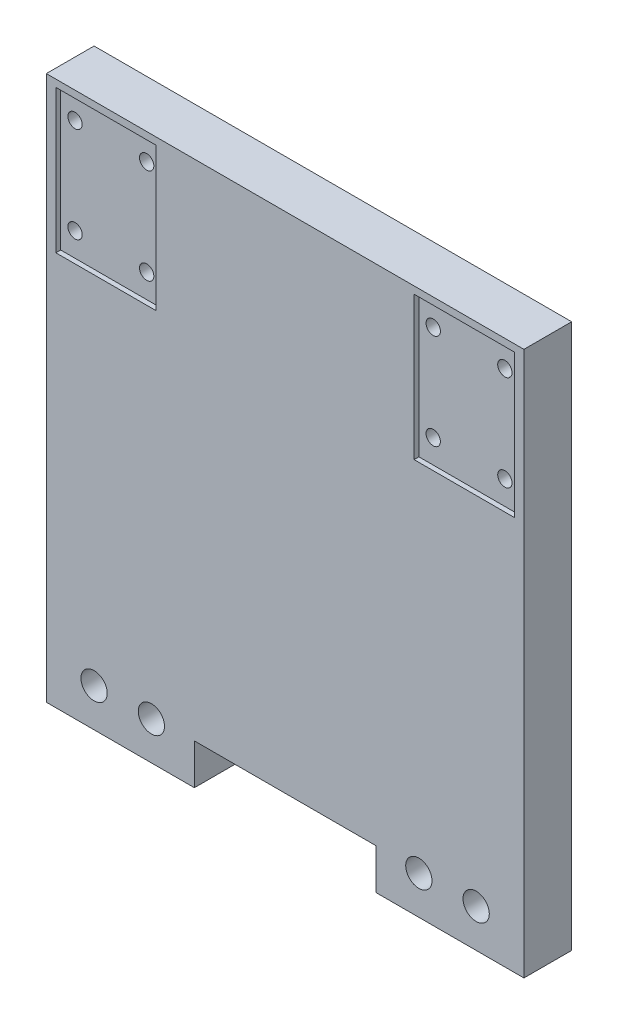
ISO-10303-21;
HEADER;
FILE_DESCRIPTION(('STEP AP214'),'2;1');
FILE_NAME('part.step','',(''),(''),'','','');
FILE_SCHEMA(('AUTOMOTIVE_DESIGN { 1 0 10303 214 1 1 1 1 }'));
ENDSEC;
DATA;
#1=APPLICATION_CONTEXT('core data for automotive mechanical design processes');
#2=APPLICATION_PROTOCOL_DEFINITION('international standard','automotive_design',2000,#1);
#3=PRODUCT_CONTEXT('',#1,'mechanical');
#4=PRODUCT('Part','Part','',(#3));
#5=PRODUCT_RELATED_PRODUCT_CATEGORY('part','',(#4));
#6=PRODUCT_DEFINITION_FORMATION('','',#4);
#7=PRODUCT_DEFINITION_CONTEXT('part definition',#1,'design');
#8=PRODUCT_DEFINITION('design','',#6,#7);
#9=PRODUCT_DEFINITION_SHAPE('','',#8);
#10=(LENGTH_UNIT() NAMED_UNIT(*) SI_UNIT(.MILLI.,.METRE.));
#11=(NAMED_UNIT(*) PLANE_ANGLE_UNIT() SI_UNIT($,.RADIAN.));
#12=(NAMED_UNIT(*) SI_UNIT($,.STERADIAN.) SOLID_ANGLE_UNIT());
#13=UNCERTAINTY_MEASURE_WITH_UNIT(LENGTH_MEASURE(1.E-05),#10,'distance_accuracy_value','');
#14=(GEOMETRIC_REPRESENTATION_CONTEXT(3) GLOBAL_UNCERTAINTY_ASSIGNED_CONTEXT((#13)) GLOBAL_UNIT_ASSIGNED_CONTEXT((#10,
#11,#12)) REPRESENTATION_CONTEXT('',''));
#15=CARTESIAN_POINT('',(0.,0.,0.));
#16=DIRECTION('',(0.,0.,1.));
#17=DIRECTION('',(1.,0.,0.));
#18=AXIS2_PLACEMENT_3D('',#15,#16,#17);
#19=CARTESIAN_POINT('',(2.,82.5,8.989915219719));
#20=DIRECTION('',(1.,0.,0.));
#21=DIRECTION('',(0.,0.,-1.));
#22=AXIS2_PLACEMENT_3D('',#19,#20,#21);
#23=PLANE('',#22);
#24=DIRECTION('',(0.,0.,1.));
#25=VECTOR('',#24,1.);
#26=CARTESIAN_POINT('',(2.,112.5,8.989915219719));
#27=LINE('',#26,#25);
#28=CARTESIAN_POINT('',(2.,112.5,8.989915219719));
#29=VERTEX_POINT('',#28);
#30=CARTESIAN_POINT('',(2.,112.5,10.0019));
#31=VERTEX_POINT('',#30);
#32=EDGE_CURVE('E147',#29,#31,#27,.T.);
#33=ORIENTED_EDGE('',*,*,#32,.T.);
#34=DIRECTION('',(0.,1.,0.));
#35=VECTOR('',#34,1.);
#36=CARTESIAN_POINT('',(2.,0.,10.0019));
#37=LINE('',#36,#35);
#38=CARTESIAN_POINT('',(2.,82.5,10.0019));
#39=VERTEX_POINT('',#38);
#40=EDGE_CURVE('E134',#39,#31,#37,.T.);
#41=ORIENTED_EDGE('',*,*,#40,.F.);
#42=DIRECTION('',(0.,0.,1.));
#43=VECTOR('',#42,1.);
#44=CARTESIAN_POINT('',(2.,82.5,8.989915219719));
#45=LINE('',#44,#43);
#46=CARTESIAN_POINT('',(2.,82.5,8.989915219719));
#47=VERTEX_POINT('',#46);
#48=EDGE_CURVE('E128',#47,#39,#45,.T.);
#49=ORIENTED_EDGE('',*,*,#48,.F.);
#50=DIRECTION('',(0.,1.,0.));
#51=VECTOR('',#50,1.);
#52=CARTESIAN_POINT('',(2.,82.5,8.989915219719));
#53=LINE('',#52,#51);
#54=EDGE_CURVE('E148',#29,#47,#53,.F.);
#55=ORIENTED_EDGE('',*,*,#54,.F.);
#56=EDGE_LOOP('',(#33,#41,#49,#55));
#57=FACE_BOUND('',#56,.T.);
#58=ADVANCED_FACE('F16',(#57),#23,.T.);
#59=CARTESIAN_POINT('',(2.,82.5,8.989915219719));
#60=DIRECTION('',(0.,1.,0.));
#61=DIRECTION('',(0.,0.,1.));
#62=AXIS2_PLACEMENT_3D('',#59,#60,#61);
#63=PLANE('',#62);
#64=DIRECTION('',(1.,0.,0.));
#65=VECTOR('',#64,1.);
#66=CARTESIAN_POINT('',(0.,82.5,10.0019));
#67=LINE('',#66,#65);
#68=CARTESIAN_POINT('',(23.,82.5,10.0019));
#69=VERTEX_POINT('',#68);
#70=EDGE_CURVE('E142',#69,#39,#67,.F.);
#71=ORIENTED_EDGE('',*,*,#70,.F.);
#72=DIRECTION('',(0.,0.,-1.));
#73=VECTOR('',#72,1.);
#74=CARTESIAN_POINT('',(23.,82.5,8.989915219719));
#75=LINE('',#74,#73);
#76=CARTESIAN_POINT('',(23.,82.5,8.989915219719));
#77=VERTEX_POINT('',#76);
#78=EDGE_CURVE('E153',#69,#77,#75,.T.);
#79=ORIENTED_EDGE('',*,*,#78,.T.);
#80=DIRECTION('',(1.,0.,0.));
#81=VECTOR('',#80,1.);
#82=CARTESIAN_POINT('',(2.,82.5,8.989915219719));
#83=LINE('',#82,#81);
#84=EDGE_CURVE('E301',#47,#77,#83,.T.);
#85=ORIENTED_EDGE('',*,*,#84,.F.);
#86=ORIENTED_EDGE('',*,*,#48,.T.);
#87=EDGE_LOOP('',(#71,#79,#85,#86));
#88=FACE_BOUND('',#87,.T.);
#89=ADVANCED_FACE('F485',(#88),#63,.T.);
#90=CARTESIAN_POINT('',(23.,82.5,8.989915219719));
#91=DIRECTION('',(1.,0.,0.));
#92=DIRECTION('',(0.,0.,-1.));
#93=AXIS2_PLACEMENT_3D('',#90,#91,#92);
#94=PLANE('',#93);
#95=DIRECTION('',(0.,0.,1.));
#96=VECTOR('',#95,1.);
#97=CARTESIAN_POINT('',(23.,112.5,8.989915219719));
#98=LINE('',#97,#96);
#99=CARTESIAN_POINT('',(23.,112.5,10.0019));
#100=VERTEX_POINT('',#99);
#101=CARTESIAN_POINT('',(23.,112.5,8.989915219719));
#102=VERTEX_POINT('',#101);
#103=EDGE_CURVE('E152',#100,#102,#98,.F.);
#104=ORIENTED_EDGE('',*,*,#103,.T.);
#105=DIRECTION('',(0.,1.,0.));
#106=VECTOR('',#105,1.);
#107=CARTESIAN_POINT('',(23.,82.5,8.989915219719));
#108=LINE('',#107,#106);
#109=EDGE_CURVE('E299',#77,#102,#108,.T.);
#110=ORIENTED_EDGE('',*,*,#109,.F.);
#111=ORIENTED_EDGE('',*,*,#78,.F.);
#112=DIRECTION('',(0.,1.,0.));
#113=VECTOR('',#112,1.);
#114=CARTESIAN_POINT('',(23.,0.,10.0019));
#115=LINE('',#114,#113);
#116=EDGE_CURVE('E157',#100,#69,#115,.F.);
#117=ORIENTED_EDGE('',*,*,#116,.F.);
#118=EDGE_LOOP('',(#104,#110,#111,#117));
#119=FACE_BOUND('',#118,.T.);
#120=ADVANCED_FACE('F483',(#119),#94,.F.);
#121=CARTESIAN_POINT('',(2.,112.5,8.989915219719));
#122=DIRECTION('',(0.,1.,0.));
#123=DIRECTION('',(0.,0.,1.));
#124=AXIS2_PLACEMENT_3D('',#121,#122,#123);
#125=PLANE('',#124);
#126=DIRECTION('',(1.,0.,0.));
#127=VECTOR('',#126,1.);
#128=CARTESIAN_POINT('',(0.,112.5,10.0019));
#129=LINE('',#128,#127);
#130=EDGE_CURVE('E140',#31,#100,#129,.T.);
#131=ORIENTED_EDGE('',*,*,#130,.F.);
#132=ORIENTED_EDGE('',*,*,#32,.F.);
#133=DIRECTION('',(1.,0.,0.));
#134=VECTOR('',#133,1.);
#135=CARTESIAN_POINT('',(2.,112.5,8.989915219719));
#136=LINE('',#135,#134);
#137=EDGE_CURVE('E297',#102,#29,#136,.F.);
#138=ORIENTED_EDGE('',*,*,#137,.F.);
#139=ORIENTED_EDGE('',*,*,#103,.F.);
#140=EDGE_LOOP('',(#131,#132,#138,#139));
#141=FACE_BOUND('',#140,.T.);
#142=ADVANCED_FACE('F155',(#141),#125,.F.);
#143=CARTESIAN_POINT('',(77.,82.5,8.989915219719));
#144=DIRECTION('',(1.,0.,0.));
#145=DIRECTION('',(0.,0.,-1.));
#146=AXIS2_PLACEMENT_3D('',#143,#144,#145);
#147=PLANE('',#146);
#148=DIRECTION('',(0.,0.,1.));
#149=VECTOR('',#148,1.);
#150=CARTESIAN_POINT('',(77.,112.5,8.989915219719));
#151=LINE('',#150,#149);
#152=CARTESIAN_POINT('',(77.,112.5,8.989915219719));
#153=VERTEX_POINT('',#152);
#154=CARTESIAN_POINT('',(77.,112.5,10.0019));
#155=VERTEX_POINT('',#154);
#156=EDGE_CURVE('E164',#153,#155,#151,.T.);
#157=ORIENTED_EDGE('',*,*,#156,.T.);
#158=DIRECTION('',(0.,1.,0.));
#159=VECTOR('',#158,1.);
#160=CARTESIAN_POINT('',(77.,0.,10.0019));
#161=LINE('',#160,#159);
#162=CARTESIAN_POINT('',(77.,82.5,10.0019));
#163=VERTEX_POINT('',#162);
#164=EDGE_CURVE('E313',#163,#155,#161,.T.);
#165=ORIENTED_EDGE('',*,*,#164,.F.);
#166=DIRECTION('',(0.,0.,1.));
#167=VECTOR('',#166,1.);
#168=CARTESIAN_POINT('',(77.,82.5,8.989915219719));
#169=LINE('',#168,#167);
#170=CARTESIAN_POINT('',(77.,82.5,8.989915219719));
#171=VERTEX_POINT('',#170);
#172=EDGE_CURVE('E170',#171,#163,#169,.T.);
#173=ORIENTED_EDGE('',*,*,#172,.F.);
#174=DIRECTION('',(0.,1.,0.));
#175=VECTOR('',#174,1.);
#176=CARTESIAN_POINT('',(77.,82.5,8.989915219719));
#177=LINE('',#176,#175);
#178=EDGE_CURVE('E295',#153,#171,#177,.F.);
#179=ORIENTED_EDGE('',*,*,#178,.F.);
#180=EDGE_LOOP('',(#157,#165,#173,#179));
#181=FACE_BOUND('',#180,.T.);
#182=ADVANCED_FACE('F322',(#181),#147,.T.);
#183=CARTESIAN_POINT('',(77.,82.5,8.989915219719));
#184=DIRECTION('',(0.,1.,0.));
#185=DIRECTION('',(0.,0.,1.));
#186=AXIS2_PLACEMENT_3D('',#183,#184,#185);
#187=PLANE('',#186);
#188=DIRECTION('',(1.,0.,0.));
#189=VECTOR('',#188,1.);
#190=CARTESIAN_POINT('',(0.,82.5,10.0019));
#191=LINE('',#190,#189);
#192=CARTESIAN_POINT('',(98.,82.5,10.0019));
#193=VERTEX_POINT('',#192);
#194=EDGE_CURVE('E304',#193,#163,#191,.F.);
#195=ORIENTED_EDGE('',*,*,#194,.F.);
#196=DIRECTION('',(0.,0.,-1.));
#197=VECTOR('',#196,1.);
#198=CARTESIAN_POINT('',(98.,82.5,8.989915219719));
#199=LINE('',#198,#197);
#200=CARTESIAN_POINT('',(98.,82.5,8.989915219719));
#201=VERTEX_POINT('',#200);
#202=EDGE_CURVE('E167',#193,#201,#199,.T.);
#203=ORIENTED_EDGE('',*,*,#202,.T.);
#204=DIRECTION('',(1.,0.,0.));
#205=VECTOR('',#204,1.);
#206=CARTESIAN_POINT('',(77.,82.5,8.989915219719));
#207=LINE('',#206,#205);
#208=EDGE_CURVE('E293',#171,#201,#207,.T.);
#209=ORIENTED_EDGE('',*,*,#208,.F.);
#210=ORIENTED_EDGE('',*,*,#172,.T.);
#211=EDGE_LOOP('',(#195,#203,#209,#210));
#212=FACE_BOUND('',#211,.T.);
#213=ADVANCED_FACE('F330',(#212),#187,.T.);
#214=CARTESIAN_POINT('',(98.,82.5,8.989915219719));
#215=DIRECTION('',(1.,0.,0.));
#216=DIRECTION('',(0.,0.,-1.));
#217=AXIS2_PLACEMENT_3D('',#214,#215,#216);
#218=PLANE('',#217);
#219=DIRECTION('',(0.,0.,1.));
#220=VECTOR('',#219,1.);
#221=CARTESIAN_POINT('',(98.,112.5,8.989915219719));
#222=LINE('',#221,#220);
#223=CARTESIAN_POINT('',(98.,112.5,10.0019));
#224=VERTEX_POINT('',#223);
#225=CARTESIAN_POINT('',(98.,112.5,8.989915219719));
#226=VERTEX_POINT('',#225);
#227=EDGE_CURVE('E144',#224,#226,#222,.F.);
#228=ORIENTED_EDGE('',*,*,#227,.T.);
#229=DIRECTION('',(0.,1.,0.));
#230=VECTOR('',#229,1.);
#231=CARTESIAN_POINT('',(98.,82.5,8.989915219719));
#232=LINE('',#231,#230);
#233=EDGE_CURVE('E291',#201,#226,#232,.T.);
#234=ORIENTED_EDGE('',*,*,#233,.F.);
#235=ORIENTED_EDGE('',*,*,#202,.F.);
#236=DIRECTION('',(0.,1.,0.));
#237=VECTOR('',#236,1.);
#238=CARTESIAN_POINT('',(98.,0.,10.0019));
#239=LINE('',#238,#237);
#240=EDGE_CURVE('E307',#224,#193,#239,.F.);
#241=ORIENTED_EDGE('',*,*,#240,.F.);
#242=EDGE_LOOP('',(#228,#234,#235,#241));
#243=FACE_BOUND('',#242,.T.);
#244=ADVANCED_FACE('F328',(#243),#218,.F.);
#245=CARTESIAN_POINT('',(77.,112.5,8.989915219719));
#246=DIRECTION('',(0.,1.,0.));
#247=DIRECTION('',(0.,0.,1.));
#248=AXIS2_PLACEMENT_3D('',#245,#246,#247);
#249=PLANE('',#248);
#250=DIRECTION('',(1.,0.,0.));
#251=VECTOR('',#250,1.);
#252=CARTESIAN_POINT('',(0.,112.5,10.0019));
#253=LINE('',#252,#251);
#254=EDGE_CURVE('E310',#155,#224,#253,.T.);
#255=ORIENTED_EDGE('',*,*,#254,.F.);
#256=ORIENTED_EDGE('',*,*,#156,.F.);
#257=DIRECTION('',(1.,0.,0.));
#258=VECTOR('',#257,1.);
#259=CARTESIAN_POINT('',(77.,112.5,8.989915219719));
#260=LINE('',#259,#258);
#261=EDGE_CURVE('E288',#226,#153,#260,.F.);
#262=ORIENTED_EDGE('',*,*,#261,.F.);
#263=ORIENTED_EDGE('',*,*,#227,.F.);
#264=EDGE_LOOP('',(#255,#256,#262,#263));
#265=FACE_BOUND('',#264,.T.);
#266=ADVANCED_FACE('F325',(#265),#249,.F.);
#267=CARTESIAN_POINT('',(0.,0.,10.0019));
#268=DIRECTION('',(0.,0.,1.));
#269=DIRECTION('',(1.,0.,0.));
#270=AXIS2_PLACEMENT_3D('',#267,#268,#269);
#271=PLANE('',#270);
#272=ORIENTED_EDGE('',*,*,#240,.T.);
#273=ORIENTED_EDGE('',*,*,#194,.T.);
#274=ORIENTED_EDGE('',*,*,#164,.T.);
#275=ORIENTED_EDGE('',*,*,#254,.T.);
#276=EDGE_LOOP('',(#272,#273,#274,#275));
#277=FACE_BOUND('',#276,.T.);
#278=ORIENTED_EDGE('',*,*,#116,.T.);
#279=ORIENTED_EDGE('',*,*,#70,.T.);
#280=ORIENTED_EDGE('',*,*,#40,.T.);
#281=ORIENTED_EDGE('',*,*,#130,.T.);
#282=EDGE_LOOP('',(#278,#279,#280,#281));
#283=FACE_BOUND('',#282,.T.);
#284=CARTESIAN_POINT('',(90.,8.,10.0019));
#285=DIRECTION('',(0.,0.,1.));
#286=DIRECTION('',(1.,0.,0.));
#287=AXIS2_PLACEMENT_3D('',#284,#285,#286);
#288=CIRCLE('',#287,2.75);
#289=CARTESIAN_POINT('',(92.75,8.,10.0019));
#290=VERTEX_POINT('',#289);
#291=EDGE_CURVE('E234',#290,#290,#288,.F.);
#292=ORIENTED_EDGE('',*,*,#291,.T.);
#293=EDGE_LOOP('',(#292));
#294=FACE_BOUND('',#293,.T.);
#295=CARTESIAN_POINT('',(78.,8.,10.0019));
#296=DIRECTION('',(0.,0.,1.));
#297=DIRECTION('',(1.,0.,0.));
#298=AXIS2_PLACEMENT_3D('',#295,#296,#297);
#299=CIRCLE('',#298,2.75);
#300=CARTESIAN_POINT('',(80.75,8.,10.0019));
#301=VERTEX_POINT('',#300);
#302=EDGE_CURVE('E237',#301,#301,#299,.F.);
#303=ORIENTED_EDGE('',*,*,#302,.T.);
#304=EDGE_LOOP('',(#303));
#305=FACE_BOUND('',#304,.T.);
#306=CARTESIAN_POINT('',(22.,8.,10.0019));
#307=DIRECTION('',(0.,0.,1.));
#308=DIRECTION('',(1.,0.,0.));
#309=AXIS2_PLACEMENT_3D('',#306,#307,#308);
#310=CIRCLE('',#309,2.75);
#311=CARTESIAN_POINT('',(24.75,8.,10.0019));
#312=VERTEX_POINT('',#311);
#313=EDGE_CURVE('E239',#312,#312,#310,.F.);
#314=ORIENTED_EDGE('',*,*,#313,.T.);
#315=EDGE_LOOP('',(#314));
#316=FACE_BOUND('',#315,.T.);
#317=CARTESIAN_POINT('',(10.,8.,10.0019));
#318=DIRECTION('',(0.,0.,1.));
#319=DIRECTION('',(1.,0.,0.));
#320=AXIS2_PLACEMENT_3D('',#317,#318,#319);
#321=CIRCLE('',#320,2.75);
#322=CARTESIAN_POINT('',(12.75,8.,10.0019));
#323=VERTEX_POINT('',#322);
#324=EDGE_CURVE('E19',#323,#323,#321,.F.);
#325=ORIENTED_EDGE('',*,*,#324,.T.);
#326=EDGE_LOOP('',(#325));
#327=FACE_BOUND('',#326,.T.);
#328=DIRECTION('',(1.,0.,0.));
#329=VECTOR('',#328,1.);
#330=CARTESIAN_POINT('',(0.,0.,10.0019));
#331=LINE('',#330,#329);
#332=CARTESIAN_POINT('',(69.,0.,10.0019));
#333=VERTEX_POINT('',#332);
#334=CARTESIAN_POINT('',(100.,0.,10.0019));
#335=VERTEX_POINT('',#334);
#336=EDGE_CURVE('E256',#333,#335,#331,.T.);
#337=ORIENTED_EDGE('',*,*,#336,.T.);
#338=DIRECTION('',(0.,1.,0.));
#339=VECTOR('',#338,1.);
#340=CARTESIAN_POINT('',(100.,0.,10.0019));
#341=LINE('',#340,#339);
#342=CARTESIAN_POINT('',(100.,114.,10.0019));
#343=VERTEX_POINT('',#342);
#344=EDGE_CURVE('E244',#343,#335,#341,.F.);
#345=ORIENTED_EDGE('',*,*,#344,.F.);
#346=DIRECTION('',(1.,0.,0.));
#347=VECTOR('',#346,1.);
#348=CARTESIAN_POINT('',(0.,114.,10.0019));
#349=LINE('',#348,#347);
#350=CARTESIAN_POINT('',(0.,114.,10.0019));
#351=VERTEX_POINT('',#350);
#352=EDGE_CURVE('E286',#351,#343,#349,.T.);
#353=ORIENTED_EDGE('',*,*,#352,.F.);
#354=DIRECTION('',(0.,1.,0.));
#355=VECTOR('',#354,1.);
#356=CARTESIAN_POINT('',(0.,0.,10.0019));
#357=LINE('',#356,#355);
#358=CARTESIAN_POINT('',(0.,0.,10.0019));
#359=VERTEX_POINT('',#358);
#360=EDGE_CURVE('E281',#351,#359,#357,.F.);
#361=ORIENTED_EDGE('',*,*,#360,.T.);
#362=DIRECTION('',(1.,0.,0.));
#363=VECTOR('',#362,1.);
#364=CARTESIAN_POINT('',(0.,0.,10.0019));
#365=LINE('',#364,#363);
#366=CARTESIAN_POINT('',(31.,0.,10.0019));
#367=VERTEX_POINT('',#366);
#368=EDGE_CURVE('E276',#359,#367,#365,.T.);
#369=ORIENTED_EDGE('',*,*,#368,.T.);
#370=DIRECTION('',(0.,1.,0.));
#371=VECTOR('',#370,1.);
#372=CARTESIAN_POINT('',(31.,0.,10.0019));
#373=LINE('',#372,#371);
#374=CARTESIAN_POINT('',(31.,8.5,10.0019));
#375=VERTEX_POINT('',#374);
#376=EDGE_CURVE('E271',#375,#367,#373,.F.);
#377=ORIENTED_EDGE('',*,*,#376,.F.);
#378=DIRECTION('',(1.,0.,0.));
#379=VECTOR('',#378,1.);
#380=CARTESIAN_POINT('',(31.,8.5,10.0019));
#381=LINE('',#380,#379);
#382=CARTESIAN_POINT('',(69.,8.5,10.0019));
#383=VERTEX_POINT('',#382);
#384=EDGE_CURVE('E266',#375,#383,#381,.T.);
#385=ORIENTED_EDGE('',*,*,#384,.T.);
#386=DIRECTION('',(0.,1.,0.));
#387=VECTOR('',#386,1.);
#388=CARTESIAN_POINT('',(69.,0.,10.0019));
#389=LINE('',#388,#387);
#390=EDGE_CURVE('E261',#383,#333,#389,.F.);
#391=ORIENTED_EDGE('',*,*,#390,.T.);
#392=EDGE_LOOP('',(#337,#345,#353,#361,#369,#377,#385,#391));
#393=FACE_BOUND('',#392,.T.);
#394=ADVANCED_FACE('F137',(#277,#283,#294,#305,#316,#327,#393),#271,.T.);
#395=CARTESIAN_POINT('',(2.,82.5,8.989915219719));
#396=DIRECTION('',(0.,0.,1.));
#397=DIRECTION('',(1.,0.,0.));
#398=AXIS2_PLACEMENT_3D('',#395,#396,#397);
#399=PLANE('',#398);
#400=CARTESIAN_POINT('',(20.,107.5,8.989915219719));
#401=DIRECTION('',(0.,0.,1.));
#402=DIRECTION('',(1.,0.,0.));
#403=AXIS2_PLACEMENT_3D('',#400,#401,#402);
#404=CIRCLE('',#403,1.5);
#405=CARTESIAN_POINT('',(21.5,107.5,8.989915219719));
#406=VERTEX_POINT('',#405);
#407=EDGE_CURVE('E222',#406,#406,#404,.F.);
#408=ORIENTED_EDGE('',*,*,#407,.T.);
#409=EDGE_LOOP('',(#408));
#410=FACE_BOUND('',#409,.T.);
#411=CARTESIAN_POINT('',(5.,107.5,8.989915219719));
#412=DIRECTION('',(0.,0.,1.));
#413=DIRECTION('',(1.,0.,0.));
#414=AXIS2_PLACEMENT_3D('',#411,#412,#413);
#415=CIRCLE('',#414,1.5);
#416=CARTESIAN_POINT('',(6.5,107.5,8.989915219719));
#417=VERTEX_POINT('',#416);
#418=EDGE_CURVE('E225',#417,#417,#415,.F.);
#419=ORIENTED_EDGE('',*,*,#418,.T.);
#420=EDGE_LOOP('',(#419));
#421=FACE_BOUND('',#420,.T.);
#422=CARTESIAN_POINT('',(20.,87.5,8.989915219719));
#423=DIRECTION('',(0.,0.,1.));
#424=DIRECTION('',(1.,0.,0.));
#425=AXIS2_PLACEMENT_3D('',#422,#423,#424);
#426=CIRCLE('',#425,1.5);
#427=CARTESIAN_POINT('',(21.5,87.5,8.989915219719));
#428=VERTEX_POINT('',#427);
#429=EDGE_CURVE('E228',#428,#428,#426,.F.);
#430=ORIENTED_EDGE('',*,*,#429,.T.);
#431=EDGE_LOOP('',(#430));
#432=FACE_BOUND('',#431,.T.);
#433=CARTESIAN_POINT('',(5.,87.5,8.989915219719));
#434=DIRECTION('',(0.,0.,1.));
#435=DIRECTION('',(1.,0.,0.));
#436=AXIS2_PLACEMENT_3D('',#433,#434,#435);
#437=CIRCLE('',#436,1.5);
#438=CARTESIAN_POINT('',(6.5,87.5,8.989915219719));
#439=VERTEX_POINT('',#438);
#440=EDGE_CURVE('E231',#439,#439,#437,.F.);
#441=ORIENTED_EDGE('',*,*,#440,.T.);
#442=EDGE_LOOP('',(#441));
#443=FACE_BOUND('',#442,.T.);
#444=ORIENTED_EDGE('',*,*,#109,.T.);
#445=ORIENTED_EDGE('',*,*,#137,.T.);
#446=ORIENTED_EDGE('',*,*,#54,.T.);
#447=ORIENTED_EDGE('',*,*,#84,.T.);
#448=EDGE_LOOP('',(#444,#445,#446,#447));
#449=FACE_BOUND('',#448,.T.);
#450=ADVANCED_FACE('F336',(#410,#421,#432,#443,#449),#399,.T.);
#451=CARTESIAN_POINT('',(77.,82.5,8.989915219719));
#452=DIRECTION('',(0.,0.,1.));
#453=DIRECTION('',(1.,0.,0.));
#454=AXIS2_PLACEMENT_3D('',#451,#452,#453);
#455=PLANE('',#454);
#456=CARTESIAN_POINT('',(95.,107.5,8.989915219719));
#457=DIRECTION('',(0.,0.,1.));
#458=DIRECTION('',(1.,0.,0.));
#459=AXIS2_PLACEMENT_3D('',#456,#457,#458);
#460=CIRCLE('',#459,1.5);
#461=CARTESIAN_POINT('',(96.5,107.5,8.989915219719));
#462=VERTEX_POINT('',#461);
#463=EDGE_CURVE('E209',#462,#462,#460,.F.);
#464=ORIENTED_EDGE('',*,*,#463,.T.);
#465=EDGE_LOOP('',(#464));
#466=FACE_BOUND('',#465,.T.);
#467=CARTESIAN_POINT('',(80.,107.5,8.989915219719));
#468=DIRECTION('',(0.,0.,1.));
#469=DIRECTION('',(1.,0.,0.));
#470=AXIS2_PLACEMENT_3D('',#467,#468,#469);
#471=CIRCLE('',#470,1.5);
#472=CARTESIAN_POINT('',(81.5,107.5,8.989915219719));
#473=VERTEX_POINT('',#472);
#474=EDGE_CURVE('E213',#473,#473,#471,.F.);
#475=ORIENTED_EDGE('',*,*,#474,.T.);
#476=EDGE_LOOP('',(#475));
#477=FACE_BOUND('',#476,.T.);
#478=CARTESIAN_POINT('',(95.,87.5,8.989915219719));
#479=DIRECTION('',(0.,0.,1.));
#480=DIRECTION('',(1.,0.,0.));
#481=AXIS2_PLACEMENT_3D('',#478,#479,#480);
#482=CIRCLE('',#481,1.5);
#483=CARTESIAN_POINT('',(96.5,87.5,8.989915219719));
#484=VERTEX_POINT('',#483);
#485=EDGE_CURVE('E216',#484,#484,#482,.F.);
#486=ORIENTED_EDGE('',*,*,#485,.T.);
#487=EDGE_LOOP('',(#486));
#488=FACE_BOUND('',#487,.T.);
#489=CARTESIAN_POINT('',(80.,87.5,8.989915219719));
#490=DIRECTION('',(0.,0.,1.));
#491=DIRECTION('',(1.,0.,0.));
#492=AXIS2_PLACEMENT_3D('',#489,#490,#491);
#493=CIRCLE('',#492,1.5);
#494=CARTESIAN_POINT('',(81.5,87.5,8.989915219719));
#495=VERTEX_POINT('',#494);
#496=EDGE_CURVE('E219',#495,#495,#493,.F.);
#497=ORIENTED_EDGE('',*,*,#496,.T.);
#498=EDGE_LOOP('',(#497));
#499=FACE_BOUND('',#498,.T.);
#500=ORIENTED_EDGE('',*,*,#233,.T.);
#501=ORIENTED_EDGE('',*,*,#261,.T.);
#502=ORIENTED_EDGE('',*,*,#178,.T.);
#503=ORIENTED_EDGE('',*,*,#208,.T.);
#504=EDGE_LOOP('',(#500,#501,#502,#503));
#505=FACE_BOUND('',#504,.T.);
#506=ADVANCED_FACE('F333',(#466,#477,#488,#499,#505),#455,.T.);
#507=CARTESIAN_POINT('',(0.,114.,0.001900000000205));
#508=DIRECTION('',(0.,1.,0.));
#509=DIRECTION('',(0.,0.,1.));
#510=AXIS2_PLACEMENT_3D('',#507,#508,#509);
#511=PLANE('',#510);
#512=ORIENTED_EDGE('',*,*,#352,.T.);
#513=DIRECTION('',(0.,0.,-1.));
#514=VECTOR('',#513,1.);
#515=CARTESIAN_POINT('',(100.,114.,0.001900000000205));
#516=LINE('',#515,#514);
#517=CARTESIAN_POINT('',(100.,114.,0.00190000000003475));
#518=VERTEX_POINT('',#517);
#519=EDGE_CURVE('E247',#518,#343,#516,.F.);
#520=ORIENTED_EDGE('',*,*,#519,.F.);
#521=DIRECTION('',(1.,0.,0.));
#522=VECTOR('',#521,1.);
#523=CARTESIAN_POINT('',(0.,114.,0.001900000000205));
#524=LINE('',#523,#522);
#525=CARTESIAN_POINT('',(0.,114.,0.00190000000003475));
#526=VERTEX_POINT('',#525);
#527=EDGE_CURVE('E212',#518,#526,#524,.F.);
#528=ORIENTED_EDGE('',*,*,#527,.T.);
#529=DIRECTION('',(0.,0.,-1.));
#530=VECTOR('',#529,1.);
#531=CARTESIAN_POINT('',(0.,114.,0.001900000000205));
#532=LINE('',#531,#530);
#533=EDGE_CURVE('E283',#526,#351,#532,.F.);
#534=ORIENTED_EDGE('',*,*,#533,.T.);
#535=EDGE_LOOP('',(#512,#520,#528,#534));
#536=FACE_BOUND('',#535,.T.);
#537=ADVANCED_FACE('F335',(#536),#511,.T.);
#538=CARTESIAN_POINT('',(0.,0.,0.001900000000205));
#539=DIRECTION('',(1.,0.,0.));
#540=DIRECTION('',(0.,0.,-1.));
#541=AXIS2_PLACEMENT_3D('',#538,#539,#540);
#542=PLANE('',#541);
#543=ORIENTED_EDGE('',*,*,#533,.F.);
#544=DIRECTION('',(0.,1.,0.));
#545=VECTOR('',#544,1.);
#546=CARTESIAN_POINT('',(0.,0.,0.001900000000205));
#547=LINE('',#546,#545);
#548=CARTESIAN_POINT('',(0.,0.,0.00190000000003475));
#549=VERTEX_POINT('',#548);
#550=EDGE_CURVE('E437',#526,#549,#547,.F.);
#551=ORIENTED_EDGE('',*,*,#550,.T.);
#552=DIRECTION('',(0.,0.,1.));
#553=VECTOR('',#552,1.);
#554=CARTESIAN_POINT('',(0.,0.,0.001900000000205));
#555=LINE('',#554,#553);
#556=EDGE_CURVE('E278',#549,#359,#555,.T.);
#557=ORIENTED_EDGE('',*,*,#556,.T.);
#558=ORIENTED_EDGE('',*,*,#360,.F.);
#559=EDGE_LOOP('',(#543,#551,#557,#558));
#560=FACE_BOUND('',#559,.T.);
#561=ADVANCED_FACE('F344',(#560),#542,.F.);
#562=CARTESIAN_POINT('',(0.,0.,0.001900000000205));
#563=DIRECTION('',(0.,1.,0.));
#564=DIRECTION('',(0.,0.,1.));
#565=AXIS2_PLACEMENT_3D('',#562,#563,#564);
#566=PLANE('',#565);
#567=ORIENTED_EDGE('',*,*,#368,.F.);
#568=ORIENTED_EDGE('',*,*,#556,.F.);
#569=DIRECTION('',(1.,0.,0.));
#570=VECTOR('',#569,1.);
#571=CARTESIAN_POINT('',(0.,0.,0.001900000000205));
#572=LINE('',#571,#570);
#573=CARTESIAN_POINT('',(31.,0.,0.00190000000003475));
#574=VERTEX_POINT('',#573);
#575=EDGE_CURVE('E445',#549,#574,#572,.T.);
#576=ORIENTED_EDGE('',*,*,#575,.T.);
#577=DIRECTION('',(0.,0.,-1.));
#578=VECTOR('',#577,1.);
#579=CARTESIAN_POINT('',(31.,0.,0.001900000000205));
#580=LINE('',#579,#578);
#581=EDGE_CURVE('E274',#367,#574,#580,.T.);
#582=ORIENTED_EDGE('',*,*,#581,.F.);
#583=EDGE_LOOP('',(#567,#568,#576,#582));
#584=FACE_BOUND('',#583,.T.);
#585=ADVANCED_FACE('F425',(#584),#566,.F.);
#586=CARTESIAN_POINT('',(31.,0.,0.001900000000205));
#587=DIRECTION('',(1.,0.,0.));
#588=DIRECTION('',(0.,0.,-1.));
#589=AXIS2_PLACEMENT_3D('',#586,#587,#588);
#590=PLANE('',#589);
#591=DIRECTION('',(0.,0.,1.));
#592=VECTOR('',#591,1.);
#593=CARTESIAN_POINT('',(31.,8.5,0.001900000000205));
#594=LINE('',#593,#592);
#595=CARTESIAN_POINT('',(31.,8.5,0.00190000000003475));
#596=VERTEX_POINT('',#595);
#597=EDGE_CURVE('E268',#596,#375,#594,.T.);
#598=ORIENTED_EDGE('',*,*,#597,.T.);
#599=ORIENTED_EDGE('',*,*,#376,.T.);
#600=ORIENTED_EDGE('',*,*,#581,.T.);
#601=DIRECTION('',(0.,1.,0.));
#602=VECTOR('',#601,1.);
#603=CARTESIAN_POINT('',(31.,0.,0.001900000000205));
#604=LINE('',#603,#602);
#605=EDGE_CURVE('E457',#574,#596,#604,.T.);
#606=ORIENTED_EDGE('',*,*,#605,.T.);
#607=EDGE_LOOP('',(#598,#599,#600,#606));
#608=FACE_BOUND('',#607,.T.);
#609=ADVANCED_FACE('F421',(#608),#590,.T.);
#610=CARTESIAN_POINT('',(31.,8.5,0.001900000000205));
#611=DIRECTION('',(0.,1.,0.));
#612=DIRECTION('',(0.,0.,1.));
#613=AXIS2_PLACEMENT_3D('',#610,#611,#612);
#614=PLANE('',#613);
#615=ORIENTED_EDGE('',*,*,#384,.F.);
#616=ORIENTED_EDGE('',*,*,#597,.F.);
#617=DIRECTION('',(1.,0.,0.));
#618=VECTOR('',#617,1.);
#619=CARTESIAN_POINT('',(0.,8.5,0.001900000000205));
#620=LINE('',#619,#618);
#621=CARTESIAN_POINT('',(69.,8.5,0.00190000000003475));
#622=VERTEX_POINT('',#621);
#623=EDGE_CURVE('E454',#596,#622,#620,.T.);
#624=ORIENTED_EDGE('',*,*,#623,.T.);
#625=DIRECTION('',(0.,0.,-1.));
#626=VECTOR('',#625,1.);
#627=CARTESIAN_POINT('',(69.,8.5,0.001900000000205));
#628=LINE('',#627,#626);
#629=EDGE_CURVE('E263',#622,#383,#628,.F.);
#630=ORIENTED_EDGE('',*,*,#629,.T.);
#631=EDGE_LOOP('',(#615,#616,#624,#630));
#632=FACE_BOUND('',#631,.T.);
#633=ADVANCED_FACE('F417',(#632),#614,.F.);
#634=CARTESIAN_POINT('',(69.,0.,0.001900000000205));
#635=DIRECTION('',(1.,0.,0.));
#636=DIRECTION('',(0.,0.,-1.));
#637=AXIS2_PLACEMENT_3D('',#634,#635,#636);
#638=PLANE('',#637);
#639=ORIENTED_EDGE('',*,*,#629,.F.);
#640=DIRECTION('',(0.,1.,0.));
#641=VECTOR('',#640,1.);
#642=CARTESIAN_POINT('',(69.,0.,0.001900000000205));
#643=LINE('',#642,#641);
#644=CARTESIAN_POINT('',(69.,0.,0.00190000000003475));
#645=VERTEX_POINT('',#644);
#646=EDGE_CURVE('E449',#622,#645,#643,.F.);
#647=ORIENTED_EDGE('',*,*,#646,.T.);
#648=DIRECTION('',(0.,0.,1.));
#649=VECTOR('',#648,1.);
#650=CARTESIAN_POINT('',(69.,0.,0.001900000000205));
#651=LINE('',#650,#649);
#652=EDGE_CURVE('E258',#645,#333,#651,.T.);
#653=ORIENTED_EDGE('',*,*,#652,.T.);
#654=ORIENTED_EDGE('',*,*,#390,.F.);
#655=EDGE_LOOP('',(#639,#647,#653,#654));
#656=FACE_BOUND('',#655,.T.);
#657=ADVANCED_FACE('F413',(#656),#638,.F.);
#658=CARTESIAN_POINT('',(0.,0.,0.001900000000205));
#659=DIRECTION('',(0.,1.,0.));
#660=DIRECTION('',(0.,0.,1.));
#661=AXIS2_PLACEMENT_3D('',#658,#659,#660);
#662=PLANE('',#661);
#663=ORIENTED_EDGE('',*,*,#336,.F.);
#664=ORIENTED_EDGE('',*,*,#652,.F.);
#665=DIRECTION('',(1.,0.,0.));
#666=VECTOR('',#665,1.);
#667=CARTESIAN_POINT('',(0.,0.,0.001900000000205));
#668=LINE('',#667,#666);
#669=CARTESIAN_POINT('',(100.,0.,0.00190000000003475));
#670=VERTEX_POINT('',#669);
#671=EDGE_CURVE('E447',#645,#670,#668,.T.);
#672=ORIENTED_EDGE('',*,*,#671,.T.);
#673=DIRECTION('',(0.,0.,-1.));
#674=VECTOR('',#673,1.);
#675=CARTESIAN_POINT('',(100.,0.,0.001900000000205));
#676=LINE('',#675,#674);
#677=EDGE_CURVE('E34',#335,#670,#676,.T.);
#678=ORIENTED_EDGE('',*,*,#677,.F.);
#679=EDGE_LOOP('',(#663,#664,#672,#678));
#680=FACE_BOUND('',#679,.T.);
#681=ADVANCED_FACE('F410',(#680),#662,.F.);
#682=CARTESIAN_POINT('',(100.,0.,0.001900000000205));
#683=DIRECTION('',(1.,0.,0.));
#684=DIRECTION('',(0.,0.,-1.));
#685=AXIS2_PLACEMENT_3D('',#682,#683,#684);
#686=PLANE('',#685);
#687=ORIENTED_EDGE('',*,*,#519,.T.);
#688=ORIENTED_EDGE('',*,*,#344,.T.);
#689=ORIENTED_EDGE('',*,*,#677,.T.);
#690=DIRECTION('',(0.,1.,0.));
#691=VECTOR('',#690,1.);
#692=CARTESIAN_POINT('',(100.,0.,0.001900000000205));
#693=LINE('',#692,#691);
#694=EDGE_CURVE('E208',#670,#518,#693,.T.);
#695=ORIENTED_EDGE('',*,*,#694,.T.);
#696=EDGE_LOOP('',(#687,#688,#689,#695));
#697=FACE_BOUND('',#696,.T.);
#698=ADVANCED_FACE('F406',(#697),#686,.T.);
#699=CARTESIAN_POINT('',(10.,8.,0.001900000000205));
#700=DIRECTION('',(0.,0.,1.));
#701=DIRECTION('',(1.,0.,0.));
#702=AXIS2_PLACEMENT_3D('',#699,#700,#701);
#703=CYLINDRICAL_SURFACE('',#702,2.75);
#704=CARTESIAN_POINT('',(10.,8.,0.001899999999978));
#705=DIRECTION('',(0.,0.,1.));
#706=DIRECTION('',(1.,0.,0.));
#707=AXIS2_PLACEMENT_3D('',#704,#705,#706);
#708=CIRCLE('',#707,2.75);
#709=CARTESIAN_POINT('',(12.75,8.,0.001899999999978));
#710=VERTEX_POINT('',#709);
#711=EDGE_CURVE('E205',#710,#710,#708,.F.);
#712=ORIENTED_EDGE('',*,*,#711,.T.);
#713=EDGE_LOOP('',(#712));
#714=FACE_BOUND('',#713,.T.);
#715=ORIENTED_EDGE('',*,*,#324,.F.);
#716=EDGE_LOOP('',(#715));
#717=FACE_BOUND('',#716,.T.);
#718=ADVANCED_FACE('F402',(#714,#717),#703,.F.);
#719=CARTESIAN_POINT('',(22.,8.,0.001900000000205));
#720=DIRECTION('',(0.,0.,1.));
#721=DIRECTION('',(1.,0.,0.));
#722=AXIS2_PLACEMENT_3D('',#719,#720,#721);
#723=CYLINDRICAL_SURFACE('',#722,2.75);
#724=CARTESIAN_POINT('',(22.,8.,0.001899999999978));
#725=DIRECTION('',(0.,0.,1.));
#726=DIRECTION('',(1.,0.,0.));
#727=AXIS2_PLACEMENT_3D('',#724,#725,#726);
#728=CIRCLE('',#727,2.75);
#729=CARTESIAN_POINT('',(24.75,8.,0.001899999999978));
#730=VERTEX_POINT('',#729);
#731=EDGE_CURVE('E202',#730,#730,#728,.F.);
#732=ORIENTED_EDGE('',*,*,#731,.T.);
#733=EDGE_LOOP('',(#732));
#734=FACE_BOUND('',#733,.T.);
#735=ORIENTED_EDGE('',*,*,#313,.F.);
#736=EDGE_LOOP('',(#735));
#737=FACE_BOUND('',#736,.T.);
#738=ADVANCED_FACE('F398',(#734,#737),#723,.F.);
#739=CARTESIAN_POINT('',(78.,8.,0.001900000000205));
#740=DIRECTION('',(0.,0.,1.));
#741=DIRECTION('',(1.,0.,0.));
#742=AXIS2_PLACEMENT_3D('',#739,#740,#741);
#743=CYLINDRICAL_SURFACE('',#742,2.75);
#744=CARTESIAN_POINT('',(78.,8.,0.001899999999978));
#745=DIRECTION('',(0.,0.,1.));
#746=DIRECTION('',(1.,0.,0.));
#747=AXIS2_PLACEMENT_3D('',#744,#745,#746);
#748=CIRCLE('',#747,2.75);
#749=CARTESIAN_POINT('',(80.75,8.,0.001899999999978));
#750=VERTEX_POINT('',#749);
#751=EDGE_CURVE('E199',#750,#750,#748,.F.);
#752=ORIENTED_EDGE('',*,*,#751,.T.);
#753=EDGE_LOOP('',(#752));
#754=FACE_BOUND('',#753,.T.);
#755=ORIENTED_EDGE('',*,*,#302,.F.);
#756=EDGE_LOOP('',(#755));
#757=FACE_BOUND('',#756,.T.);
#758=ADVANCED_FACE('F394',(#754,#757),#743,.F.);
#759=CARTESIAN_POINT('',(90.,8.,0.001900000000205));
#760=DIRECTION('',(0.,0.,1.));
#761=DIRECTION('',(1.,0.,0.));
#762=AXIS2_PLACEMENT_3D('',#759,#760,#761);
#763=CYLINDRICAL_SURFACE('',#762,2.75);
#764=CARTESIAN_POINT('',(90.,8.,0.001899999999978));
#765=DIRECTION('',(0.,0.,1.));
#766=DIRECTION('',(1.,0.,0.));
#767=AXIS2_PLACEMENT_3D('',#764,#765,#766);
#768=CIRCLE('',#767,2.75);
#769=CARTESIAN_POINT('',(92.75,8.,0.001899999999978));
#770=VERTEX_POINT('',#769);
#771=EDGE_CURVE('E196',#770,#770,#768,.F.);
#772=ORIENTED_EDGE('',*,*,#771,.T.);
#773=EDGE_LOOP('',(#772));
#774=FACE_BOUND('',#773,.T.);
#775=ORIENTED_EDGE('',*,*,#291,.F.);
#776=EDGE_LOOP('',(#775));
#777=FACE_BOUND('',#776,.T.);
#778=ADVANCED_FACE('F390',(#774,#777),#763,.F.);
#779=CARTESIAN_POINT('',(5.,87.5,0.001900000000205));
#780=DIRECTION('',(0.,0.,1.));
#781=DIRECTION('',(1.,0.,0.));
#782=AXIS2_PLACEMENT_3D('',#779,#780,#781);
#783=CYLINDRICAL_SURFACE('',#782,1.5);
#784=CARTESIAN_POINT('',(5.,87.5,0.001899999999978));
#785=DIRECTION('',(0.,0.,1.));
#786=DIRECTION('',(1.,0.,0.));
#787=AXIS2_PLACEMENT_3D('',#784,#785,#786);
#788=CIRCLE('',#787,1.5);
#789=CARTESIAN_POINT('',(6.5,87.5,0.001899999999978));
#790=VERTEX_POINT('',#789);
#791=EDGE_CURVE('E193',#790,#790,#788,.F.);
#792=ORIENTED_EDGE('',*,*,#791,.T.);
#793=EDGE_LOOP('',(#792));
#794=FACE_BOUND('',#793,.T.);
#795=ORIENTED_EDGE('',*,*,#440,.F.);
#796=EDGE_LOOP('',(#795));
#797=FACE_BOUND('',#796,.T.);
#798=ADVANCED_FACE('F386',(#794,#797),#783,.F.);
#799=CARTESIAN_POINT('',(20.,87.5,0.001900000000205));
#800=DIRECTION('',(0.,0.,1.));
#801=DIRECTION('',(1.,0.,0.));
#802=AXIS2_PLACEMENT_3D('',#799,#800,#801);
#803=CYLINDRICAL_SURFACE('',#802,1.5);
#804=CARTESIAN_POINT('',(20.,87.5,0.001899999999978));
#805=DIRECTION('',(0.,0.,1.));
#806=DIRECTION('',(1.,0.,0.));
#807=AXIS2_PLACEMENT_3D('',#804,#805,#806);
#808=CIRCLE('',#807,1.5);
#809=CARTESIAN_POINT('',(21.5,87.5,0.001899999999978));
#810=VERTEX_POINT('',#809);
#811=EDGE_CURVE('E190',#810,#810,#808,.F.);
#812=ORIENTED_EDGE('',*,*,#811,.T.);
#813=EDGE_LOOP('',(#812));
#814=FACE_BOUND('',#813,.T.);
#815=ORIENTED_EDGE('',*,*,#429,.F.);
#816=EDGE_LOOP('',(#815));
#817=FACE_BOUND('',#816,.T.);
#818=ADVANCED_FACE('F382',(#814,#817),#803,.F.);
#819=CARTESIAN_POINT('',(5.,107.5,0.001900000000205));
#820=DIRECTION('',(0.,0.,1.));
#821=DIRECTION('',(1.,0.,0.));
#822=AXIS2_PLACEMENT_3D('',#819,#820,#821);
#823=CYLINDRICAL_SURFACE('',#822,1.5);
#824=CARTESIAN_POINT('',(5.,107.5,0.001899999999978));
#825=DIRECTION('',(0.,0.,1.));
#826=DIRECTION('',(1.,0.,0.));
#827=AXIS2_PLACEMENT_3D('',#824,#825,#826);
#828=CIRCLE('',#827,1.5);
#829=CARTESIAN_POINT('',(6.5,107.5,0.001899999999978));
#830=VERTEX_POINT('',#829);
#831=EDGE_CURVE('E187',#830,#830,#828,.F.);
#832=ORIENTED_EDGE('',*,*,#831,.T.);
#833=EDGE_LOOP('',(#832));
#834=FACE_BOUND('',#833,.T.);
#835=ORIENTED_EDGE('',*,*,#418,.F.);
#836=EDGE_LOOP('',(#835));
#837=FACE_BOUND('',#836,.T.);
#838=ADVANCED_FACE('F378',(#834,#837),#823,.F.);
#839=CARTESIAN_POINT('',(20.,107.5,0.001900000000205));
#840=DIRECTION('',(0.,0.,1.));
#841=DIRECTION('',(1.,0.,0.));
#842=AXIS2_PLACEMENT_3D('',#839,#840,#841);
#843=CYLINDRICAL_SURFACE('',#842,1.5);
#844=CARTESIAN_POINT('',(20.,107.5,0.001899999999978));
#845=DIRECTION('',(0.,0.,1.));
#846=DIRECTION('',(1.,0.,0.));
#847=AXIS2_PLACEMENT_3D('',#844,#845,#846);
#848=CIRCLE('',#847,1.5);
#849=CARTESIAN_POINT('',(21.5,107.5,0.001899999999978));
#850=VERTEX_POINT('',#849);
#851=EDGE_CURVE('E184',#850,#850,#848,.F.);
#852=ORIENTED_EDGE('',*,*,#851,.T.);
#853=EDGE_LOOP('',(#852));
#854=FACE_BOUND('',#853,.T.);
#855=ORIENTED_EDGE('',*,*,#407,.F.);
#856=EDGE_LOOP('',(#855));
#857=FACE_BOUND('',#856,.T.);
#858=ADVANCED_FACE('F374',(#854,#857),#843,.F.);
#859=CARTESIAN_POINT('',(80.,87.5,0.001900000000205));
#860=DIRECTION('',(0.,0.,1.));
#861=DIRECTION('',(1.,0.,0.));
#862=AXIS2_PLACEMENT_3D('',#859,#860,#861);
#863=CYLINDRICAL_SURFACE('',#862,1.5);
#864=CARTESIAN_POINT('',(80.,87.5,0.001899999999978));
#865=DIRECTION('',(0.,0.,1.));
#866=DIRECTION('',(1.,0.,0.));
#867=AXIS2_PLACEMENT_3D('',#864,#865,#866);
#868=CIRCLE('',#867,1.5);
#869=CARTESIAN_POINT('',(81.5,87.5,0.001899999999978));
#870=VERTEX_POINT('',#869);
#871=EDGE_CURVE('E181',#870,#870,#868,.F.);
#872=ORIENTED_EDGE('',*,*,#871,.T.);
#873=EDGE_LOOP('',(#872));
#874=FACE_BOUND('',#873,.T.);
#875=ORIENTED_EDGE('',*,*,#496,.F.);
#876=EDGE_LOOP('',(#875));
#877=FACE_BOUND('',#876,.T.);
#878=ADVANCED_FACE('F370',(#874,#877),#863,.F.);
#879=CARTESIAN_POINT('',(95.,87.5,0.001900000000205));
#880=DIRECTION('',(0.,0.,1.));
#881=DIRECTION('',(1.,0.,0.));
#882=AXIS2_PLACEMENT_3D('',#879,#880,#881);
#883=CYLINDRICAL_SURFACE('',#882,1.5);
#884=CARTESIAN_POINT('',(95.,87.5,0.001899999999978));
#885=DIRECTION('',(0.,0.,1.));
#886=DIRECTION('',(1.,0.,0.));
#887=AXIS2_PLACEMENT_3D('',#884,#885,#886);
#888=CIRCLE('',#887,1.5);
#889=CARTESIAN_POINT('',(96.5,87.5,0.001899999999978));
#890=VERTEX_POINT('',#889);
#891=EDGE_CURVE('E178',#890,#890,#888,.F.);
#892=ORIENTED_EDGE('',*,*,#891,.T.);
#893=EDGE_LOOP('',(#892));
#894=FACE_BOUND('',#893,.T.);
#895=ORIENTED_EDGE('',*,*,#485,.F.);
#896=EDGE_LOOP('',(#895));
#897=FACE_BOUND('',#896,.T.);
#898=ADVANCED_FACE('F366',(#894,#897),#883,.F.);
#899=CARTESIAN_POINT('',(80.,107.5,0.001900000000205));
#900=DIRECTION('',(0.,0.,1.));
#901=DIRECTION('',(1.,0.,0.));
#902=AXIS2_PLACEMENT_3D('',#899,#900,#901);
#903=CYLINDRICAL_SURFACE('',#902,1.5);
#904=CARTESIAN_POINT('',(80.,107.5,0.001899999999978));
#905=DIRECTION('',(0.,0.,1.));
#906=DIRECTION('',(1.,0.,0.));
#907=AXIS2_PLACEMENT_3D('',#904,#905,#906);
#908=CIRCLE('',#907,1.5);
#909=CARTESIAN_POINT('',(81.5,107.5,0.001899999999978));
#910=VERTEX_POINT('',#909);
#911=EDGE_CURVE('E25',#910,#910,#908,.F.);
#912=ORIENTED_EDGE('',*,*,#911,.T.);
#913=EDGE_LOOP('',(#912));
#914=FACE_BOUND('',#913,.T.);
#915=ORIENTED_EDGE('',*,*,#474,.F.);
#916=EDGE_LOOP('',(#915));
#917=FACE_BOUND('',#916,.T.);
#918=ADVANCED_FACE('F358',(#914,#917),#903,.F.);
#919=CARTESIAN_POINT('',(95.,107.5,0.001900000000205));
#920=DIRECTION('',(0.,0.,1.));
#921=DIRECTION('',(1.,0.,0.));
#922=AXIS2_PLACEMENT_3D('',#919,#920,#921);
#923=CYLINDRICAL_SURFACE('',#922,1.5);
#924=CARTESIAN_POINT('',(95.,107.5,0.001899999999978));
#925=DIRECTION('',(0.,0.,1.));
#926=DIRECTION('',(1.,0.,0.));
#927=AXIS2_PLACEMENT_3D('',#924,#925,#926);
#928=CIRCLE('',#927,1.5);
#929=CARTESIAN_POINT('',(96.5,107.5,0.001899999999978));
#930=VERTEX_POINT('',#929);
#931=EDGE_CURVE('E11',#930,#930,#928,.F.);
#932=ORIENTED_EDGE('',*,*,#931,.T.);
#933=EDGE_LOOP('',(#932));
#934=FACE_BOUND('',#933,.T.);
#935=ORIENTED_EDGE('',*,*,#463,.F.);
#936=EDGE_LOOP('',(#935));
#937=FACE_BOUND('',#936,.T.);
#938=ADVANCED_FACE('F352',(#934,#937),#923,.F.);
#939=CARTESIAN_POINT('',(0.,0.,0.001900000000205));
#940=DIRECTION('',(0.,0.,1.));
#941=DIRECTION('',(1.,0.,0.));
#942=AXIS2_PLACEMENT_3D('',#939,#940,#941);
#943=PLANE('',#942);
#944=ORIENTED_EDGE('',*,*,#931,.F.);
#945=EDGE_LOOP('',(#944));
#946=FACE_BOUND('',#945,.T.);
#947=ORIENTED_EDGE('',*,*,#911,.F.);
#948=EDGE_LOOP('',(#947));
#949=FACE_BOUND('',#948,.T.);
#950=ORIENTED_EDGE('',*,*,#891,.F.);
#951=EDGE_LOOP('',(#950));
#952=FACE_BOUND('',#951,.T.);
#953=ORIENTED_EDGE('',*,*,#871,.F.);
#954=EDGE_LOOP('',(#953));
#955=FACE_BOUND('',#954,.T.);
#956=ORIENTED_EDGE('',*,*,#851,.F.);
#957=EDGE_LOOP('',(#956));
#958=FACE_BOUND('',#957,.T.);
#959=ORIENTED_EDGE('',*,*,#831,.F.);
#960=EDGE_LOOP('',(#959));
#961=FACE_BOUND('',#960,.T.);
#962=ORIENTED_EDGE('',*,*,#811,.F.);
#963=EDGE_LOOP('',(#962));
#964=FACE_BOUND('',#963,.T.);
#965=ORIENTED_EDGE('',*,*,#791,.F.);
#966=EDGE_LOOP('',(#965));
#967=FACE_BOUND('',#966,.T.);
#968=ORIENTED_EDGE('',*,*,#771,.F.);
#969=EDGE_LOOP('',(#968));
#970=FACE_BOUND('',#969,.T.);
#971=ORIENTED_EDGE('',*,*,#751,.F.);
#972=EDGE_LOOP('',(#971));
#973=FACE_BOUND('',#972,.T.);
#974=ORIENTED_EDGE('',*,*,#731,.F.);
#975=EDGE_LOOP('',(#974));
#976=FACE_BOUND('',#975,.T.);
#977=ORIENTED_EDGE('',*,*,#711,.F.);
#978=EDGE_LOOP('',(#977));
#979=FACE_BOUND('',#978,.T.);
#980=ORIENTED_EDGE('',*,*,#671,.F.);
#981=ORIENTED_EDGE('',*,*,#646,.F.);
#982=ORIENTED_EDGE('',*,*,#623,.F.);
#983=ORIENTED_EDGE('',*,*,#605,.F.);
#984=ORIENTED_EDGE('',*,*,#575,.F.);
#985=ORIENTED_EDGE('',*,*,#550,.F.);
#986=ORIENTED_EDGE('',*,*,#527,.F.);
#987=ORIENTED_EDGE('',*,*,#694,.F.);
#988=EDGE_LOOP('',(#980,#981,#982,#983,#984,#985,#986,#987));
#989=FACE_BOUND('',#988,.T.);
#990=ADVANCED_FACE('F350',(#946,#949,#952,#955,#958,#961,#964,#967,#970,#973,#976,#979,#989),
#943,.F.);
#991=CLOSED_SHELL('',(#58,#89,#120,#142,#182,#213,#244,#266,#394,#450,#506,#537,#561,#585,#609,
#633,#657,#681,#698,#718,#738,#758,#778,#798,#818,#838,#858,#878,#898,#918,#938,#990));
#992=MANIFOLD_SOLID_BREP('B1',#991);
#993=ADVANCED_BREP_SHAPE_REPRESENTATION('',(#18,#992),#14);
#994=SHAPE_DEFINITION_REPRESENTATION(#9,#993);
ENDSEC;
END-ISO-10303-21;
